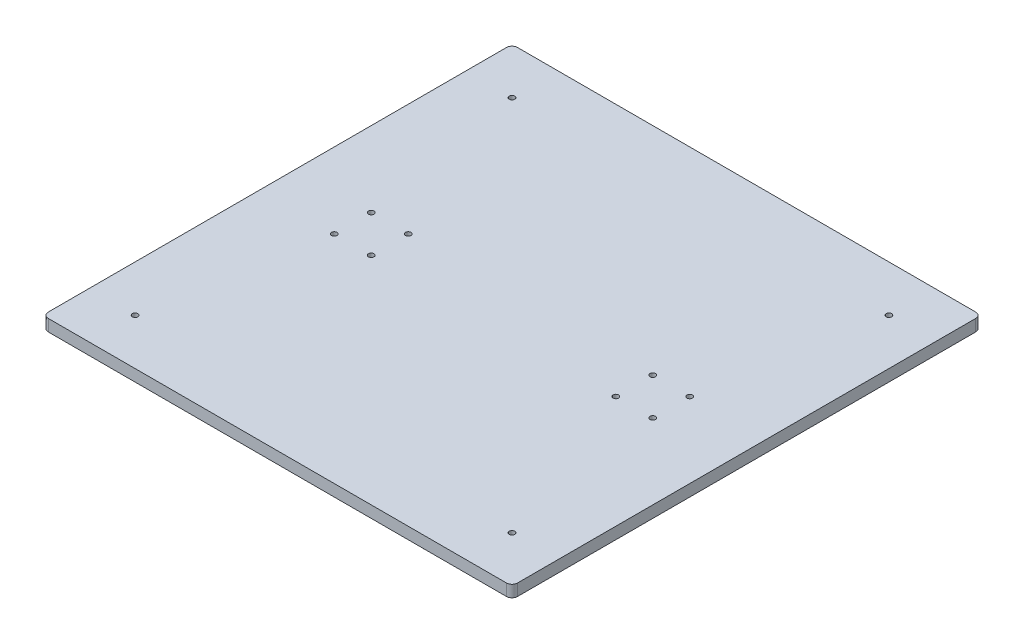
ISO-10303-21;
HEADER;
FILE_DESCRIPTION(('STEP AP214'),'2;1');
FILE_NAME('part.step','',(''),(''),'','','');
FILE_SCHEMA(('AUTOMOTIVE_DESIGN { 1 0 10303 214 1 1 1 1 }'));
ENDSEC;
DATA;
#1=APPLICATION_CONTEXT('core data for automotive mechanical design processes');
#2=APPLICATION_PROTOCOL_DEFINITION('international standard','automotive_design',2000,#1);
#3=PRODUCT_CONTEXT('',#1,'mechanical');
#4=PRODUCT('Part','Part','',(#3));
#5=PRODUCT_RELATED_PRODUCT_CATEGORY('part','',(#4));
#6=PRODUCT_DEFINITION_FORMATION('','',#4);
#7=PRODUCT_DEFINITION_CONTEXT('part definition',#1,'design');
#8=PRODUCT_DEFINITION('design','',#6,#7);
#9=PRODUCT_DEFINITION_SHAPE('','',#8);
#10=(LENGTH_UNIT() NAMED_UNIT(*) SI_UNIT(.MILLI.,.METRE.));
#11=(NAMED_UNIT(*) PLANE_ANGLE_UNIT() SI_UNIT($,.RADIAN.));
#12=(NAMED_UNIT(*) SI_UNIT($,.STERADIAN.) SOLID_ANGLE_UNIT());
#13=UNCERTAINTY_MEASURE_WITH_UNIT(LENGTH_MEASURE(1.E-05),#10,'distance_accuracy_value','');
#14=(GEOMETRIC_REPRESENTATION_CONTEXT(3) GLOBAL_UNCERTAINTY_ASSIGNED_CONTEXT((#13)) GLOBAL_UNIT_ASSIGNED_CONTEXT((#10,
#11,#12)) REPRESENTATION_CONTEXT('',''));
#15=CARTESIAN_POINT('',(0.,0.,0.));
#16=DIRECTION('',(0.,0.,1.));
#17=DIRECTION('',(1.,0.,0.));
#18=AXIS2_PLACEMENT_3D('',#15,#16,#17);
#19=CARTESIAN_POINT('',(-124.,6.35,124.));
#20=DIRECTION('',(0.,-1.,0.));
#21=DIRECTION('',(0.,0.,-1.));
#22=AXIS2_PLACEMENT_3D('',#19,#20,#21);
#23=CYLINDRICAL_SURFACE('',#22,3.);
#24=CARTESIAN_POINT('',(-124.,0.,124.));
#25=DIRECTION('',(0.,1.,0.));
#26=DIRECTION('',(0.,0.,1.));
#27=AXIS2_PLACEMENT_3D('',#24,#25,#26);
#28=CIRCLE('',#27,3.);
#29=CARTESIAN_POINT('',(-127.,0.,124.));
#30=VERTEX_POINT('',#29);
#31=CARTESIAN_POINT('',(-124.,0.,127.));
#32=VERTEX_POINT('',#31);
#33=EDGE_CURVE('E140',#30,#32,#28,.T.);
#34=ORIENTED_EDGE('',*,*,#33,.T.);
#35=DIRECTION('',(0.,-1.,0.));
#36=VECTOR('',#35,1.);
#37=CARTESIAN_POINT('',(-124.,6.35,127.));
#38=LINE('',#37,#36);
#39=CARTESIAN_POINT('',(-124.,6.35,127.));
#40=VERTEX_POINT('',#39);
#41=EDGE_CURVE('E11',#40,#32,#38,.T.);
#42=ORIENTED_EDGE('',*,*,#41,.F.);
#43=CARTESIAN_POINT('',(-124.,6.35,124.));
#44=DIRECTION('',(0.,1.,0.));
#45=DIRECTION('',(0.,0.,1.));
#46=AXIS2_PLACEMENT_3D('',#43,#44,#45);
#47=CIRCLE('',#46,3.);
#48=CARTESIAN_POINT('',(-127.,6.35,124.));
#49=VERTEX_POINT('',#48);
#50=EDGE_CURVE('E163',#49,#40,#47,.T.);
#51=ORIENTED_EDGE('',*,*,#50,.F.);
#52=DIRECTION('',(0.,-1.,0.));
#53=VECTOR('',#52,1.);
#54=CARTESIAN_POINT('',(-127.,6.35,124.));
#55=LINE('',#54,#53);
#56=EDGE_CURVE('E136',#49,#30,#55,.T.);
#57=ORIENTED_EDGE('',*,*,#56,.T.);
#58=EDGE_LOOP('',(#34,#42,#51,#57));
#59=FACE_BOUND('',#58,.T.);
#60=ADVANCED_FACE('F39',(#59),#23,.T.);
#61=CARTESIAN_POINT('',(-124.,6.35,127.));
#62=DIRECTION('',(0.,0.,-1.));
#63=DIRECTION('',(-1.,0.,0.));
#64=AXIS2_PLACEMENT_3D('',#61,#62,#63);
#65=PLANE('',#64);
#66=DIRECTION('',(1.,0.,0.));
#67=VECTOR('',#66,1.);
#68=CARTESIAN_POINT('',(-124.,0.,127.));
#69=LINE('',#68,#67);
#70=CARTESIAN_POINT('',(124.,0.,127.));
#71=VERTEX_POINT('',#70);
#72=EDGE_CURVE('E144',#32,#71,#69,.T.);
#73=ORIENTED_EDGE('',*,*,#72,.T.);
#74=DIRECTION('',(0.,-1.,0.));
#75=VECTOR('',#74,1.);
#76=CARTESIAN_POINT('',(124.,6.35,127.));
#77=LINE('',#76,#75);
#78=CARTESIAN_POINT('',(124.,6.35,127.));
#79=VERTEX_POINT('',#78);
#80=EDGE_CURVE('E48',#79,#71,#77,.T.);
#81=ORIENTED_EDGE('',*,*,#80,.F.);
#82=DIRECTION('',(1.,0.,0.));
#83=VECTOR('',#82,1.);
#84=CARTESIAN_POINT('',(-124.,6.35,127.));
#85=LINE('',#84,#83);
#86=EDGE_CURVE('E99',#40,#79,#85,.T.);
#87=ORIENTED_EDGE('',*,*,#86,.F.);
#88=ORIENTED_EDGE('',*,*,#41,.T.);
#89=EDGE_LOOP('',(#73,#81,#87,#88));
#90=FACE_BOUND('',#89,.T.);
#91=ADVANCED_FACE('F347',(#90),#65,.F.);
#92=CARTESIAN_POINT('',(124.,6.35,124.));
#93=DIRECTION('',(0.,-1.,0.));
#94=DIRECTION('',(0.,0.,-1.));
#95=AXIS2_PLACEMENT_3D('',#92,#93,#94);
#96=CYLINDRICAL_SURFACE('',#95,3.);
#97=CARTESIAN_POINT('',(124.,0.,124.));
#98=DIRECTION('',(0.,1.,0.));
#99=DIRECTION('',(0.,0.,1.));
#100=AXIS2_PLACEMENT_3D('',#97,#98,#99);
#101=CIRCLE('',#100,3.);
#102=CARTESIAN_POINT('',(127.,0.,124.));
#103=VERTEX_POINT('',#102);
#104=EDGE_CURVE('E148',#71,#103,#101,.T.);
#105=ORIENTED_EDGE('',*,*,#104,.T.);
#106=DIRECTION('',(0.,-1.,0.));
#107=VECTOR('',#106,1.);
#108=CARTESIAN_POINT('',(127.,6.35,124.));
#109=LINE('',#108,#107);
#110=CARTESIAN_POINT('',(127.,6.35,124.));
#111=VERTEX_POINT('',#110);
#112=EDGE_CURVE('E174',#111,#103,#109,.T.);
#113=ORIENTED_EDGE('',*,*,#112,.F.);
#114=CARTESIAN_POINT('',(124.,6.35,124.));
#115=DIRECTION('',(0.,1.,0.));
#116=DIRECTION('',(0.,0.,1.));
#117=AXIS2_PLACEMENT_3D('',#114,#115,#116);
#118=CIRCLE('',#117,3.);
#119=EDGE_CURVE('E184',#79,#111,#118,.T.);
#120=ORIENTED_EDGE('',*,*,#119,.F.);
#121=ORIENTED_EDGE('',*,*,#80,.T.);
#122=EDGE_LOOP('',(#105,#113,#120,#121));
#123=FACE_BOUND('',#122,.T.);
#124=ADVANCED_FACE('F182',(#123),#96,.T.);
#125=CARTESIAN_POINT('',(127.,6.35,-124.));
#126=DIRECTION('',(-1.,0.,0.));
#127=DIRECTION('',(0.,0.,1.));
#128=AXIS2_PLACEMENT_3D('',#125,#126,#127);
#129=PLANE('',#128);
#130=DIRECTION('',(0.,0.,-1.));
#131=VECTOR('',#130,1.);
#132=CARTESIAN_POINT('',(127.,0.,-124.));
#133=LINE('',#132,#131);
#134=CARTESIAN_POINT('',(127.,0.,-124.));
#135=VERTEX_POINT('',#134);
#136=EDGE_CURVE('E151',#103,#135,#133,.T.);
#137=ORIENTED_EDGE('',*,*,#136,.T.);
#138=DIRECTION('',(0.,-1.,0.));
#139=VECTOR('',#138,1.);
#140=CARTESIAN_POINT('',(127.,6.35,-124.));
#141=LINE('',#140,#139);
#142=CARTESIAN_POINT('',(127.,6.35,-124.));
#143=VERTEX_POINT('',#142);
#144=EDGE_CURVE('E170',#143,#135,#141,.T.);
#145=ORIENTED_EDGE('',*,*,#144,.F.);
#146=DIRECTION('',(0.,0.,-1.));
#147=VECTOR('',#146,1.);
#148=CARTESIAN_POINT('',(127.,6.35,-124.));
#149=LINE('',#148,#147);
#150=EDGE_CURVE('E197',#111,#143,#149,.T.);
#151=ORIENTED_EDGE('',*,*,#150,.F.);
#152=ORIENTED_EDGE('',*,*,#112,.T.);
#153=EDGE_LOOP('',(#137,#145,#151,#152));
#154=FACE_BOUND('',#153,.T.);
#155=ADVANCED_FACE('F192',(#154),#129,.F.);
#156=CARTESIAN_POINT('',(124.,6.35,-124.));
#157=DIRECTION('',(0.,-1.,0.));
#158=DIRECTION('',(0.,0.,-1.));
#159=AXIS2_PLACEMENT_3D('',#156,#157,#158);
#160=CYLINDRICAL_SURFACE('',#159,3.);
#161=CARTESIAN_POINT('',(124.,0.,-124.));
#162=DIRECTION('',(0.,1.,0.));
#163=DIRECTION('',(0.,0.,-1.));
#164=AXIS2_PLACEMENT_3D('',#161,#162,#163);
#165=CIRCLE('',#164,3.);
#166=CARTESIAN_POINT('',(124.,0.,-127.));
#167=VERTEX_POINT('',#166);
#168=EDGE_CURVE('E154',#135,#167,#165,.T.);
#169=ORIENTED_EDGE('',*,*,#168,.T.);
#170=DIRECTION('',(0.,-1.,0.));
#171=VECTOR('',#170,1.);
#172=CARTESIAN_POINT('',(124.,6.35,-127.));
#173=LINE('',#172,#171);
#174=CARTESIAN_POINT('',(124.,6.35,-127.));
#175=VERTEX_POINT('',#174);
#176=EDGE_CURVE('E129',#175,#167,#173,.T.);
#177=ORIENTED_EDGE('',*,*,#176,.F.);
#178=CARTESIAN_POINT('',(124.,6.35,-124.));
#179=DIRECTION('',(0.,1.,0.));
#180=DIRECTION('',(0.,0.,-1.));
#181=AXIS2_PLACEMENT_3D('',#178,#179,#180);
#182=CIRCLE('',#181,3.);
#183=EDGE_CURVE('E118',#143,#175,#182,.T.);
#184=ORIENTED_EDGE('',*,*,#183,.F.);
#185=ORIENTED_EDGE('',*,*,#144,.T.);
#186=EDGE_LOOP('',(#169,#177,#184,#185));
#187=FACE_BOUND('',#186,.T.);
#188=ADVANCED_FACE('F195',(#187),#160,.T.);
#189=CARTESIAN_POINT('',(-124.,6.35,-127.));
#190=DIRECTION('',(0.,0.,1.));
#191=DIRECTION('',(1.,0.,0.));
#192=AXIS2_PLACEMENT_3D('',#189,#190,#191);
#193=PLANE('',#192);
#194=DIRECTION('',(-1.,0.,0.));
#195=VECTOR('',#194,1.);
#196=CARTESIAN_POINT('',(-124.,0.,-127.));
#197=LINE('',#196,#195);
#198=CARTESIAN_POINT('',(-124.,0.,-127.));
#199=VERTEX_POINT('',#198);
#200=EDGE_CURVE('E127',#167,#199,#197,.T.);
#201=ORIENTED_EDGE('',*,*,#200,.T.);
#202=DIRECTION('',(0.,-1.,0.));
#203=VECTOR('',#202,1.);
#204=CARTESIAN_POINT('',(-124.,6.35,-127.));
#205=LINE('',#204,#203);
#206=CARTESIAN_POINT('',(-124.,6.35,-127.));
#207=VERTEX_POINT('',#206);
#208=EDGE_CURVE('E124',#207,#199,#205,.T.);
#209=ORIENTED_EDGE('',*,*,#208,.F.);
#210=DIRECTION('',(-1.,0.,0.));
#211=VECTOR('',#210,1.);
#212=CARTESIAN_POINT('',(-124.,6.35,-127.));
#213=LINE('',#212,#211);
#214=EDGE_CURVE('E112',#175,#207,#213,.T.);
#215=ORIENTED_EDGE('',*,*,#214,.F.);
#216=ORIENTED_EDGE('',*,*,#176,.T.);
#217=EDGE_LOOP('',(#201,#209,#215,#216));
#218=FACE_BOUND('',#217,.T.);
#219=ADVANCED_FACE('F125',(#218),#193,.F.);
#220=CARTESIAN_POINT('',(-124.,6.35,-124.));
#221=DIRECTION('',(0.,-1.,0.));
#222=DIRECTION('',(0.,0.,-1.));
#223=AXIS2_PLACEMENT_3D('',#220,#221,#222);
#224=CYLINDRICAL_SURFACE('',#223,3.);
#225=CARTESIAN_POINT('',(-124.,0.,-124.));
#226=DIRECTION('',(0.,1.,0.));
#227=DIRECTION('',(0.,0.,1.));
#228=AXIS2_PLACEMENT_3D('',#225,#226,#227);
#229=CIRCLE('',#228,3.);
#230=CARTESIAN_POINT('',(-127.,0.,-124.));
#231=VERTEX_POINT('',#230);
#232=EDGE_CURVE('E85',#199,#231,#229,.T.);
#233=ORIENTED_EDGE('',*,*,#232,.T.);
#234=DIRECTION('',(0.,-1.,0.));
#235=VECTOR('',#234,1.);
#236=CARTESIAN_POINT('',(-127.,6.35,-124.));
#237=LINE('',#236,#235);
#238=CARTESIAN_POINT('',(-127.,6.35,-124.));
#239=VERTEX_POINT('',#238);
#240=EDGE_CURVE('E130',#239,#231,#237,.T.);
#241=ORIENTED_EDGE('',*,*,#240,.F.);
#242=CARTESIAN_POINT('',(-124.,6.35,-124.));
#243=DIRECTION('',(0.,1.,0.));
#244=DIRECTION('',(0.,0.,1.));
#245=AXIS2_PLACEMENT_3D('',#242,#243,#244);
#246=CIRCLE('',#245,3.);
#247=EDGE_CURVE('E116',#207,#239,#246,.T.);
#248=ORIENTED_EDGE('',*,*,#247,.F.);
#249=ORIENTED_EDGE('',*,*,#208,.T.);
#250=EDGE_LOOP('',(#233,#241,#248,#249));
#251=FACE_BOUND('',#250,.T.);
#252=ADVANCED_FACE('F132',(#251),#224,.T.);
#253=CARTESIAN_POINT('',(-127.,6.35,-124.));
#254=DIRECTION('',(1.,0.,0.));
#255=DIRECTION('',(0.,0.,-1.));
#256=AXIS2_PLACEMENT_3D('',#253,#254,#255);
#257=PLANE('',#256);
#258=DIRECTION('',(0.,0.,1.));
#259=VECTOR('',#258,1.);
#260=CARTESIAN_POINT('',(-127.,0.,-124.));
#261=LINE('',#260,#259);
#262=EDGE_CURVE('E91',#231,#30,#261,.T.);
#263=ORIENTED_EDGE('',*,*,#262,.T.);
#264=ORIENTED_EDGE('',*,*,#56,.F.);
#265=DIRECTION('',(0.,0.,1.));
#266=VECTOR('',#265,1.);
#267=CARTESIAN_POINT('',(-127.,6.35,-124.));
#268=LINE('',#267,#266);
#269=EDGE_CURVE('E56',#239,#49,#268,.T.);
#270=ORIENTED_EDGE('',*,*,#269,.F.);
#271=ORIENTED_EDGE('',*,*,#240,.T.);
#272=EDGE_LOOP('',(#263,#264,#270,#271));
#273=FACE_BOUND('',#272,.T.);
#274=ADVANCED_FACE('F307',(#273),#257,.F.);
#275=CARTESIAN_POINT('',(-124.,6.35,124.));
#276=DIRECTION('',(0.,1.,0.));
#277=DIRECTION('',(0.,0.,1.));
#278=AXIS2_PLACEMENT_3D('',#275,#276,#277);
#279=PLANE('',#278);
#280=CARTESIAN_POINT('',(-66.2,6.35,-10.));
#281=DIRECTION('',(0.,1.,0.));
#282=DIRECTION('',(0.,0.,1.));
#283=AXIS2_PLACEMENT_3D('',#280,#281,#282);
#284=CIRCLE('',#283,1.5);
#285=CARTESIAN_POINT('',(-66.2,6.35,-8.5));
#286=VERTEX_POINT('',#285);
#287=EDGE_CURVE('E298',#286,#286,#284,.T.);
#288=ORIENTED_EDGE('',*,*,#287,.F.);
#289=EDGE_LOOP('',(#288));
#290=FACE_BOUND('',#289,.T.);
#291=CARTESIAN_POINT('',(-66.2,6.35,10.));
#292=DIRECTION('',(0.,1.,0.));
#293=DIRECTION('',(0.,0.,1.));
#294=AXIS2_PLACEMENT_3D('',#291,#292,#293);
#295=CIRCLE('',#294,1.5);
#296=CARTESIAN_POINT('',(-66.2,6.35,11.5));
#297=VERTEX_POINT('',#296);
#298=EDGE_CURVE('E290',#297,#297,#295,.T.);
#299=ORIENTED_EDGE('',*,*,#298,.F.);
#300=EDGE_LOOP('',(#299));
#301=FACE_BOUND('',#300,.T.);
#302=CARTESIAN_POINT('',(-86.2,6.35,10.0256168534274));
#303=DIRECTION('',(0.,1.,0.));
#304=DIRECTION('',(0.,0.,1.));
#305=AXIS2_PLACEMENT_3D('',#302,#303,#304);
#306=CIRCLE('',#305,1.5);
#307=CARTESIAN_POINT('',(-86.2,6.35,11.5256168534274));
#308=VERTEX_POINT('',#307);
#309=EDGE_CURVE('E282',#308,#308,#306,.T.);
#310=ORIENTED_EDGE('',*,*,#309,.F.);
#311=EDGE_LOOP('',(#310));
#312=FACE_BOUND('',#311,.T.);
#313=CARTESIAN_POINT('',(-86.2,6.35,-9.97438314657265));
#314=DIRECTION('',(0.,1.,0.));
#315=DIRECTION('',(0.,0.,1.));
#316=AXIS2_PLACEMENT_3D('',#313,#314,#315);
#317=CIRCLE('',#316,1.5);
#318=CARTESIAN_POINT('',(-86.2,6.35,-8.47438314657264));
#319=VERTEX_POINT('',#318);
#320=EDGE_CURVE('E274',#319,#319,#317,.T.);
#321=ORIENTED_EDGE('',*,*,#320,.F.);
#322=EDGE_LOOP('',(#321));
#323=FACE_BOUND('',#322,.T.);
#324=CARTESIAN_POINT('',(86.2,6.35,-9.97438314657265));
#325=DIRECTION('',(0.,1.,0.));
#326=DIRECTION('',(0.,0.,1.));
#327=AXIS2_PLACEMENT_3D('',#324,#325,#326);
#328=CIRCLE('',#327,1.5);
#329=CARTESIAN_POINT('',(86.2,6.35,-8.47438314657264));
#330=VERTEX_POINT('',#329);
#331=EDGE_CURVE('E266',#330,#330,#328,.T.);
#332=ORIENTED_EDGE('',*,*,#331,.F.);
#333=EDGE_LOOP('',(#332));
#334=FACE_BOUND('',#333,.T.);
#335=CARTESIAN_POINT('',(86.2,6.35,10.0256168534274));
#336=DIRECTION('',(0.,1.,0.));
#337=DIRECTION('',(0.,0.,1.));
#338=AXIS2_PLACEMENT_3D('',#335,#336,#337);
#339=CIRCLE('',#338,1.5);
#340=CARTESIAN_POINT('',(86.2,6.35,11.5256168534274));
#341=VERTEX_POINT('',#340);
#342=EDGE_CURVE('E258',#341,#341,#339,.T.);
#343=ORIENTED_EDGE('',*,*,#342,.F.);
#344=EDGE_LOOP('',(#343));
#345=FACE_BOUND('',#344,.T.);
#346=CARTESIAN_POINT('',(66.2,6.35,10.));
#347=DIRECTION('',(0.,1.,0.));
#348=DIRECTION('',(0.,0.,1.));
#349=AXIS2_PLACEMENT_3D('',#346,#347,#348);
#350=CIRCLE('',#349,1.5);
#351=CARTESIAN_POINT('',(66.2,6.35,11.5));
#352=VERTEX_POINT('',#351);
#353=EDGE_CURVE('E250',#352,#352,#350,.T.);
#354=ORIENTED_EDGE('',*,*,#353,.F.);
#355=EDGE_LOOP('',(#354));
#356=FACE_BOUND('',#355,.T.);
#357=CARTESIAN_POINT('',(66.2,6.35,-10.));
#358=DIRECTION('',(0.,1.,0.));
#359=DIRECTION('',(0.,0.,1.));
#360=AXIS2_PLACEMENT_3D('',#357,#358,#359);
#361=CIRCLE('',#360,1.5);
#362=CARTESIAN_POINT('',(66.2,6.35,-8.5));
#363=VERTEX_POINT('',#362);
#364=EDGE_CURVE('E242',#363,#363,#361,.T.);
#365=ORIENTED_EDGE('',*,*,#364,.F.);
#366=EDGE_LOOP('',(#365));
#367=FACE_BOUND('',#366,.T.);
#368=CARTESIAN_POINT('',(-102.,6.35,-102.));
#369=DIRECTION('',(0.,1.,0.));
#370=DIRECTION('',(0.,0.,1.));
#371=AXIS2_PLACEMENT_3D('',#368,#369,#370);
#372=CIRCLE('',#371,1.5);
#373=CARTESIAN_POINT('',(-102.,6.35,-100.5));
#374=VERTEX_POINT('',#373);
#375=EDGE_CURVE('E234',#374,#374,#372,.T.);
#376=ORIENTED_EDGE('',*,*,#375,.F.);
#377=EDGE_LOOP('',(#376));
#378=FACE_BOUND('',#377,.T.);
#379=CARTESIAN_POINT('',(-102.,6.35,102.));
#380=DIRECTION('',(0.,1.,0.));
#381=DIRECTION('',(0.,0.,1.));
#382=AXIS2_PLACEMENT_3D('',#379,#380,#381);
#383=CIRCLE('',#382,1.5);
#384=CARTESIAN_POINT('',(-102.,6.35,103.5));
#385=VERTEX_POINT('',#384);
#386=EDGE_CURVE('E226',#385,#385,#383,.T.);
#387=ORIENTED_EDGE('',*,*,#386,.F.);
#388=EDGE_LOOP('',(#387));
#389=FACE_BOUND('',#388,.T.);
#390=CARTESIAN_POINT('',(102.,6.35,102.));
#391=DIRECTION('',(0.,1.,0.));
#392=DIRECTION('',(0.,0.,1.));
#393=AXIS2_PLACEMENT_3D('',#390,#391,#392);
#394=CIRCLE('',#393,1.5);
#395=CARTESIAN_POINT('',(102.,6.35,103.5));
#396=VERTEX_POINT('',#395);
#397=EDGE_CURVE('E218',#396,#396,#394,.T.);
#398=ORIENTED_EDGE('',*,*,#397,.F.);
#399=EDGE_LOOP('',(#398));
#400=FACE_BOUND('',#399,.T.);
#401=CARTESIAN_POINT('',(102.,6.35,-102.));
#402=DIRECTION('',(0.,1.,0.));
#403=DIRECTION('',(0.,0.,1.));
#404=AXIS2_PLACEMENT_3D('',#401,#402,#403);
#405=CIRCLE('',#404,1.5);
#406=CARTESIAN_POINT('',(102.,6.35,-100.5));
#407=VERTEX_POINT('',#406);
#408=EDGE_CURVE('E210',#407,#407,#405,.T.);
#409=ORIENTED_EDGE('',*,*,#408,.F.);
#410=EDGE_LOOP('',(#409));
#411=FACE_BOUND('',#410,.T.);
#412=ORIENTED_EDGE('',*,*,#50,.T.);
#413=ORIENTED_EDGE('',*,*,#86,.T.);
#414=ORIENTED_EDGE('',*,*,#119,.T.);
#415=ORIENTED_EDGE('',*,*,#150,.T.);
#416=ORIENTED_EDGE('',*,*,#183,.T.);
#417=ORIENTED_EDGE('',*,*,#214,.T.);
#418=ORIENTED_EDGE('',*,*,#247,.T.);
#419=ORIENTED_EDGE('',*,*,#269,.T.);
#420=EDGE_LOOP('',(#412,#413,#414,#415,#416,#417,#418,#419));
#421=FACE_BOUND('',#420,.T.);
#422=ADVANCED_FACE('F114',(#290,#301,#312,#323,#334,#345,#356,#367,#378,#389,#400,#411,#421),
#279,.T.);
#423=CARTESIAN_POINT('',(-124.,0.,124.));
#424=DIRECTION('',(0.,1.,0.));
#425=DIRECTION('',(0.,0.,1.));
#426=AXIS2_PLACEMENT_3D('',#423,#424,#425);
#427=PLANE('',#426);
#428=CARTESIAN_POINT('',(-66.2,0.,-10.));
#429=DIRECTION('',(0.,1.,0.));
#430=DIRECTION('',(0.,0.,1.));
#431=AXIS2_PLACEMENT_3D('',#428,#429,#430);
#432=CIRCLE('',#431,1.5);
#433=CARTESIAN_POINT('',(-66.2,0.,-8.5));
#434=VERTEX_POINT('',#433);
#435=EDGE_CURVE('E294',#434,#434,#432,.T.);
#436=ORIENTED_EDGE('',*,*,#435,.T.);
#437=EDGE_LOOP('',(#436));
#438=FACE_BOUND('',#437,.T.);
#439=CARTESIAN_POINT('',(-66.2,0.,10.));
#440=DIRECTION('',(0.,1.,0.));
#441=DIRECTION('',(0.,0.,1.));
#442=AXIS2_PLACEMENT_3D('',#439,#440,#441);
#443=CIRCLE('',#442,1.5);
#444=CARTESIAN_POINT('',(-66.2,0.,11.5));
#445=VERTEX_POINT('',#444);
#446=EDGE_CURVE('E286',#445,#445,#443,.T.);
#447=ORIENTED_EDGE('',*,*,#446,.T.);
#448=EDGE_LOOP('',(#447));
#449=FACE_BOUND('',#448,.T.);
#450=CARTESIAN_POINT('',(-86.2,0.,10.0256168534274));
#451=DIRECTION('',(0.,1.,0.));
#452=DIRECTION('',(0.,0.,1.));
#453=AXIS2_PLACEMENT_3D('',#450,#451,#452);
#454=CIRCLE('',#453,1.5);
#455=CARTESIAN_POINT('',(-86.2,0.,11.5256168534274));
#456=VERTEX_POINT('',#455);
#457=EDGE_CURVE('E278',#456,#456,#454,.T.);
#458=ORIENTED_EDGE('',*,*,#457,.T.);
#459=EDGE_LOOP('',(#458));
#460=FACE_BOUND('',#459,.T.);
#461=CARTESIAN_POINT('',(-86.2,0.,-9.97438314657265));
#462=DIRECTION('',(0.,1.,0.));
#463=DIRECTION('',(0.,0.,1.));
#464=AXIS2_PLACEMENT_3D('',#461,#462,#463);
#465=CIRCLE('',#464,1.5);
#466=CARTESIAN_POINT('',(-86.2,0.,-8.47438314657264));
#467=VERTEX_POINT('',#466);
#468=EDGE_CURVE('E270',#467,#467,#465,.T.);
#469=ORIENTED_EDGE('',*,*,#468,.T.);
#470=EDGE_LOOP('',(#469));
#471=FACE_BOUND('',#470,.T.);
#472=CARTESIAN_POINT('',(86.2,0.,-9.97438314657265));
#473=DIRECTION('',(0.,1.,0.));
#474=DIRECTION('',(0.,0.,1.));
#475=AXIS2_PLACEMENT_3D('',#472,#473,#474);
#476=CIRCLE('',#475,1.5);
#477=CARTESIAN_POINT('',(86.2,0.,-8.47438314657264));
#478=VERTEX_POINT('',#477);
#479=EDGE_CURVE('E262',#478,#478,#476,.T.);
#480=ORIENTED_EDGE('',*,*,#479,.T.);
#481=EDGE_LOOP('',(#480));
#482=FACE_BOUND('',#481,.T.);
#483=CARTESIAN_POINT('',(86.2,0.,10.0256168534274));
#484=DIRECTION('',(0.,1.,0.));
#485=DIRECTION('',(0.,0.,1.));
#486=AXIS2_PLACEMENT_3D('',#483,#484,#485);
#487=CIRCLE('',#486,1.5);
#488=CARTESIAN_POINT('',(86.2,0.,11.5256168534274));
#489=VERTEX_POINT('',#488);
#490=EDGE_CURVE('E254',#489,#489,#487,.T.);
#491=ORIENTED_EDGE('',*,*,#490,.T.);
#492=EDGE_LOOP('',(#491));
#493=FACE_BOUND('',#492,.T.);
#494=CARTESIAN_POINT('',(66.2,0.,10.));
#495=DIRECTION('',(0.,1.,0.));
#496=DIRECTION('',(0.,0.,1.));
#497=AXIS2_PLACEMENT_3D('',#494,#495,#496);
#498=CIRCLE('',#497,1.5);
#499=CARTESIAN_POINT('',(66.2,0.,11.5));
#500=VERTEX_POINT('',#499);
#501=EDGE_CURVE('E246',#500,#500,#498,.T.);
#502=ORIENTED_EDGE('',*,*,#501,.T.);
#503=EDGE_LOOP('',(#502));
#504=FACE_BOUND('',#503,.T.);
#505=CARTESIAN_POINT('',(66.2,0.,-10.));
#506=DIRECTION('',(0.,1.,0.));
#507=DIRECTION('',(0.,0.,1.));
#508=AXIS2_PLACEMENT_3D('',#505,#506,#507);
#509=CIRCLE('',#508,1.5);
#510=CARTESIAN_POINT('',(66.2,0.,-8.5));
#511=VERTEX_POINT('',#510);
#512=EDGE_CURVE('E238',#511,#511,#509,.T.);
#513=ORIENTED_EDGE('',*,*,#512,.T.);
#514=EDGE_LOOP('',(#513));
#515=FACE_BOUND('',#514,.T.);
#516=CARTESIAN_POINT('',(-102.,0.,-102.));
#517=DIRECTION('',(0.,1.,0.));
#518=DIRECTION('',(0.,0.,1.));
#519=AXIS2_PLACEMENT_3D('',#516,#517,#518);
#520=CIRCLE('',#519,1.5);
#521=CARTESIAN_POINT('',(-102.,0.,-100.5));
#522=VERTEX_POINT('',#521);
#523=EDGE_CURVE('E230',#522,#522,#520,.T.);
#524=ORIENTED_EDGE('',*,*,#523,.T.);
#525=EDGE_LOOP('',(#524));
#526=FACE_BOUND('',#525,.T.);
#527=CARTESIAN_POINT('',(-102.,0.,102.));
#528=DIRECTION('',(0.,1.,0.));
#529=DIRECTION('',(0.,0.,1.));
#530=AXIS2_PLACEMENT_3D('',#527,#528,#529);
#531=CIRCLE('',#530,1.5);
#532=CARTESIAN_POINT('',(-102.,0.,103.5));
#533=VERTEX_POINT('',#532);
#534=EDGE_CURVE('E222',#533,#533,#531,.T.);
#535=ORIENTED_EDGE('',*,*,#534,.T.);
#536=EDGE_LOOP('',(#535));
#537=FACE_BOUND('',#536,.T.);
#538=CARTESIAN_POINT('',(102.,0.,102.));
#539=DIRECTION('',(0.,1.,0.));
#540=DIRECTION('',(0.,0.,1.));
#541=AXIS2_PLACEMENT_3D('',#538,#539,#540);
#542=CIRCLE('',#541,1.5);
#543=CARTESIAN_POINT('',(102.,0.,103.5));
#544=VERTEX_POINT('',#543);
#545=EDGE_CURVE('E214',#544,#544,#542,.T.);
#546=ORIENTED_EDGE('',*,*,#545,.T.);
#547=EDGE_LOOP('',(#546));
#548=FACE_BOUND('',#547,.T.);
#549=CARTESIAN_POINT('',(102.,0.,-102.));
#550=DIRECTION('',(0.,1.,0.));
#551=DIRECTION('',(0.,0.,1.));
#552=AXIS2_PLACEMENT_3D('',#549,#550,#551);
#553=CIRCLE('',#552,1.5);
#554=CARTESIAN_POINT('',(102.,0.,-100.5));
#555=VERTEX_POINT('',#554);
#556=EDGE_CURVE('E145',#555,#555,#553,.T.);
#557=ORIENTED_EDGE('',*,*,#556,.T.);
#558=EDGE_LOOP('',(#557));
#559=FACE_BOUND('',#558,.T.);
#560=ORIENTED_EDGE('',*,*,#33,.F.);
#561=ORIENTED_EDGE('',*,*,#262,.F.);
#562=ORIENTED_EDGE('',*,*,#232,.F.);
#563=ORIENTED_EDGE('',*,*,#200,.F.);
#564=ORIENTED_EDGE('',*,*,#168,.F.);
#565=ORIENTED_EDGE('',*,*,#136,.F.);
#566=ORIENTED_EDGE('',*,*,#104,.F.);
#567=ORIENTED_EDGE('',*,*,#72,.F.);
#568=EDGE_LOOP('',(#560,#561,#562,#563,#564,#565,#566,#567));
#569=FACE_BOUND('',#568,.T.);
#570=ADVANCED_FACE('F188',(#438,#449,#460,#471,#482,#493,#504,#515,#526,#537,#548,#559,#569),
#427,.F.);
#571=CARTESIAN_POINT('',(102.,6.35,-102.));
#572=DIRECTION('',(0.,1.,0.));
#573=DIRECTION('',(0.,0.,1.));
#574=AXIS2_PLACEMENT_3D('',#571,#572,#573);
#575=CYLINDRICAL_SURFACE('',#574,1.5);
#576=ORIENTED_EDGE('',*,*,#556,.F.);
#577=EDGE_LOOP('',(#576));
#578=FACE_BOUND('',#577,.T.);
#579=ORIENTED_EDGE('',*,*,#408,.T.);
#580=EDGE_LOOP('',(#579));
#581=FACE_BOUND('',#580,.T.);
#582=ADVANCED_FACE('F331',(#578,#581),#575,.F.);
#583=CARTESIAN_POINT('',(102.,6.35,102.));
#584=DIRECTION('',(0.,1.,0.));
#585=DIRECTION('',(0.,0.,1.));
#586=AXIS2_PLACEMENT_3D('',#583,#584,#585);
#587=CYLINDRICAL_SURFACE('',#586,1.5);
#588=ORIENTED_EDGE('',*,*,#545,.F.);
#589=EDGE_LOOP('',(#588));
#590=FACE_BOUND('',#589,.T.);
#591=ORIENTED_EDGE('',*,*,#397,.T.);
#592=EDGE_LOOP('',(#591));
#593=FACE_BOUND('',#592,.T.);
#594=ADVANCED_FACE('F333',(#590,#593),#587,.F.);
#595=CARTESIAN_POINT('',(-102.,6.35,102.));
#596=DIRECTION('',(0.,1.,0.));
#597=DIRECTION('',(0.,0.,1.));
#598=AXIS2_PLACEMENT_3D('',#595,#596,#597);
#599=CYLINDRICAL_SURFACE('',#598,1.5);
#600=ORIENTED_EDGE('',*,*,#534,.F.);
#601=EDGE_LOOP('',(#600));
#602=FACE_BOUND('',#601,.T.);
#603=ORIENTED_EDGE('',*,*,#386,.T.);
#604=EDGE_LOOP('',(#603));
#605=FACE_BOUND('',#604,.T.);
#606=ADVANCED_FACE('F340',(#602,#605),#599,.F.);
#607=CARTESIAN_POINT('',(-102.,6.35,-102.));
#608=DIRECTION('',(0.,1.,0.));
#609=DIRECTION('',(0.,0.,1.));
#610=AXIS2_PLACEMENT_3D('',#607,#608,#609);
#611=CYLINDRICAL_SURFACE('',#610,1.5);
#612=ORIENTED_EDGE('',*,*,#523,.F.);
#613=EDGE_LOOP('',(#612));
#614=FACE_BOUND('',#613,.T.);
#615=ORIENTED_EDGE('',*,*,#375,.T.);
#616=EDGE_LOOP('',(#615));
#617=FACE_BOUND('',#616,.T.);
#618=ADVANCED_FACE('F413',(#614,#617),#611,.F.);
#619=CARTESIAN_POINT('',(66.2,6.35,-10.));
#620=DIRECTION('',(0.,1.,0.));
#621=DIRECTION('',(0.,0.,1.));
#622=AXIS2_PLACEMENT_3D('',#619,#620,#621);
#623=CYLINDRICAL_SURFACE('',#622,1.5);
#624=ORIENTED_EDGE('',*,*,#512,.F.);
#625=EDGE_LOOP('',(#624));
#626=FACE_BOUND('',#625,.T.);
#627=ORIENTED_EDGE('',*,*,#364,.T.);
#628=EDGE_LOOP('',(#627));
#629=FACE_BOUND('',#628,.T.);
#630=ADVANCED_FACE('F423',(#626,#629),#623,.F.);
#631=CARTESIAN_POINT('',(66.2,6.35,10.));
#632=DIRECTION('',(0.,1.,0.));
#633=DIRECTION('',(0.,0.,1.));
#634=AXIS2_PLACEMENT_3D('',#631,#632,#633);
#635=CYLINDRICAL_SURFACE('',#634,1.5);
#636=ORIENTED_EDGE('',*,*,#501,.F.);
#637=EDGE_LOOP('',(#636));
#638=FACE_BOUND('',#637,.T.);
#639=ORIENTED_EDGE('',*,*,#353,.T.);
#640=EDGE_LOOP('',(#639));
#641=FACE_BOUND('',#640,.T.);
#642=ADVANCED_FACE('F443',(#638,#641),#635,.F.);
#643=CARTESIAN_POINT('',(86.2,6.35,10.0256168534274));
#644=DIRECTION('',(0.,1.,0.));
#645=DIRECTION('',(0.,0.,1.));
#646=AXIS2_PLACEMENT_3D('',#643,#644,#645);
#647=CYLINDRICAL_SURFACE('',#646,1.5);
#648=ORIENTED_EDGE('',*,*,#490,.F.);
#649=EDGE_LOOP('',(#648));
#650=FACE_BOUND('',#649,.T.);
#651=ORIENTED_EDGE('',*,*,#342,.T.);
#652=EDGE_LOOP('',(#651));
#653=FACE_BOUND('',#652,.T.);
#654=ADVANCED_FACE('F453',(#650,#653),#647,.F.);
#655=CARTESIAN_POINT('',(86.2,6.35,-9.97438314657265));
#656=DIRECTION('',(0.,1.,0.));
#657=DIRECTION('',(0.,0.,1.));
#658=AXIS2_PLACEMENT_3D('',#655,#656,#657);
#659=CYLINDRICAL_SURFACE('',#658,1.5);
#660=ORIENTED_EDGE('',*,*,#479,.F.);
#661=EDGE_LOOP('',(#660));
#662=FACE_BOUND('',#661,.T.);
#663=ORIENTED_EDGE('',*,*,#331,.T.);
#664=EDGE_LOOP('',(#663));
#665=FACE_BOUND('',#664,.T.);
#666=ADVANCED_FACE('F463',(#662,#665),#659,.F.);
#667=CARTESIAN_POINT('',(-86.2,6.35,-9.97438314657265));
#668=DIRECTION('',(0.,1.,0.));
#669=DIRECTION('',(0.,0.,1.));
#670=AXIS2_PLACEMENT_3D('',#667,#668,#669);
#671=CYLINDRICAL_SURFACE('',#670,1.5);
#672=ORIENTED_EDGE('',*,*,#468,.F.);
#673=EDGE_LOOP('',(#672));
#674=FACE_BOUND('',#673,.T.);
#675=ORIENTED_EDGE('',*,*,#320,.T.);
#676=EDGE_LOOP('',(#675));
#677=FACE_BOUND('',#676,.T.);
#678=ADVANCED_FACE('F473',(#674,#677),#671,.F.);
#679=CARTESIAN_POINT('',(-86.2,6.35,10.0256168534274));
#680=DIRECTION('',(0.,1.,0.));
#681=DIRECTION('',(0.,0.,1.));
#682=AXIS2_PLACEMENT_3D('',#679,#680,#681);
#683=CYLINDRICAL_SURFACE('',#682,1.5);
#684=ORIENTED_EDGE('',*,*,#457,.F.);
#685=EDGE_LOOP('',(#684));
#686=FACE_BOUND('',#685,.T.);
#687=ORIENTED_EDGE('',*,*,#309,.T.);
#688=EDGE_LOOP('',(#687));
#689=FACE_BOUND('',#688,.T.);
#690=ADVANCED_FACE('F483',(#686,#689),#683,.F.);
#691=CARTESIAN_POINT('',(-66.2,6.35,10.));
#692=DIRECTION('',(0.,1.,0.));
#693=DIRECTION('',(0.,0.,1.));
#694=AXIS2_PLACEMENT_3D('',#691,#692,#693);
#695=CYLINDRICAL_SURFACE('',#694,1.5);
#696=ORIENTED_EDGE('',*,*,#446,.F.);
#697=EDGE_LOOP('',(#696));
#698=FACE_BOUND('',#697,.T.);
#699=ORIENTED_EDGE('',*,*,#298,.T.);
#700=EDGE_LOOP('',(#699));
#701=FACE_BOUND('',#700,.T.);
#702=ADVANCED_FACE('F493',(#698,#701),#695,.F.);
#703=CARTESIAN_POINT('',(-66.2,6.35,-10.));
#704=DIRECTION('',(0.,1.,0.));
#705=DIRECTION('',(0.,0.,1.));
#706=AXIS2_PLACEMENT_3D('',#703,#704,#705);
#707=CYLINDRICAL_SURFACE('',#706,1.5);
#708=ORIENTED_EDGE('',*,*,#435,.F.);
#709=EDGE_LOOP('',(#708));
#710=FACE_BOUND('',#709,.T.);
#711=ORIENTED_EDGE('',*,*,#287,.T.);
#712=EDGE_LOOP('',(#711));
#713=FACE_BOUND('',#712,.T.);
#714=ADVANCED_FACE('F303',(#710,#713),#707,.F.);
#715=CLOSED_SHELL('',(#60,#91,#124,#155,#188,#219,#252,#274,#422,#570,#582,#594,#606,#618,#630,
#642,#654,#666,#678,#690,#702,#714));
#716=MANIFOLD_SOLID_BREP('B2',#715);
#717=ADVANCED_BREP_SHAPE_REPRESENTATION('',(#18,#716),#14);
#718=SHAPE_DEFINITION_REPRESENTATION(#9,#717);
ENDSEC;
END-ISO-10303-21;
